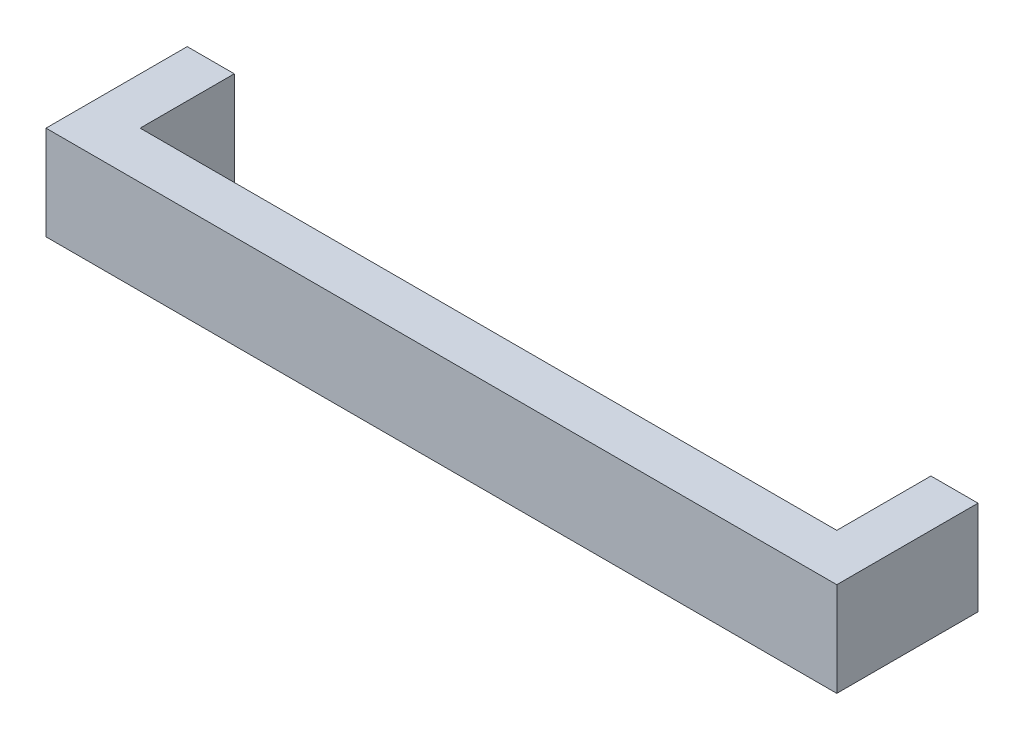
ISO-10303-21;
HEADER;
FILE_DESCRIPTION(('STEP AP214'),'2;1');
FILE_NAME('part.step','',(''),(''),'','','');
FILE_SCHEMA(('AUTOMOTIVE_DESIGN { 1 0 10303 214 1 1 1 1 }'));
ENDSEC;
DATA;
#1=APPLICATION_CONTEXT('core data for automotive mechanical design processes');
#2=APPLICATION_PROTOCOL_DEFINITION('international standard','automotive_design',2000,#1);
#3=PRODUCT_CONTEXT('',#1,'mechanical');
#4=PRODUCT('Part','Part','',(#3));
#5=PRODUCT_RELATED_PRODUCT_CATEGORY('part','',(#4));
#6=PRODUCT_DEFINITION_FORMATION('','',#4);
#7=PRODUCT_DEFINITION_CONTEXT('part definition',#1,'design');
#8=PRODUCT_DEFINITION('design','',#6,#7);
#9=PRODUCT_DEFINITION_SHAPE('','',#8);
#10=(LENGTH_UNIT() NAMED_UNIT(*) SI_UNIT(.MILLI.,.METRE.));
#11=(NAMED_UNIT(*) PLANE_ANGLE_UNIT() SI_UNIT($,.RADIAN.));
#12=(NAMED_UNIT(*) SI_UNIT($,.STERADIAN.) SOLID_ANGLE_UNIT());
#13=UNCERTAINTY_MEASURE_WITH_UNIT(LENGTH_MEASURE(1.E-05),#10,'distance_accuracy_value','');
#14=(GEOMETRIC_REPRESENTATION_CONTEXT(3) GLOBAL_UNCERTAINTY_ASSIGNED_CONTEXT((#13)) GLOBAL_UNIT_ASSIGNED_CONTEXT((#10,
#11,#12)) REPRESENTATION_CONTEXT('',''));
#15=CARTESIAN_POINT('',(0.,0.,0.));
#16=DIRECTION('',(0.,0.,1.));
#17=DIRECTION('',(1.,0.,0.));
#18=AXIS2_PLACEMENT_3D('',#15,#16,#17);
#19=CARTESIAN_POINT('',(79.,10.,0.));
#20=DIRECTION('',(-1.,0.,0.));
#21=DIRECTION('',(0.,0.,1.));
#22=AXIS2_PLACEMENT_3D('',#19,#20,#21);
#23=PLANE('',#22);
#24=DIRECTION('',(0.,0.,-1.));
#25=VECTOR('',#24,1.);
#26=CARTESIAN_POINT('',(79.,0.,0.));
#27=LINE('',#26,#25);
#28=CARTESIAN_POINT('',(79.,0.,5.));
#29=VERTEX_POINT('',#28);
#30=CARTESIAN_POINT('',(79.,0.,-10.));
#31=VERTEX_POINT('',#30);
#32=EDGE_CURVE('E134',#29,#31,#27,.T.);
#33=ORIENTED_EDGE('',*,*,#32,.T.);
#34=DIRECTION('',(0.,-1.,0.));
#35=VECTOR('',#34,1.);
#36=CARTESIAN_POINT('',(79.,10.,-10.));
#37=LINE('',#36,#35);
#38=CARTESIAN_POINT('',(79.,10.,-10.));
#39=VERTEX_POINT('',#38);
#40=EDGE_CURVE('E11',#39,#31,#37,.T.);
#41=ORIENTED_EDGE('',*,*,#40,.F.);
#42=DIRECTION('',(0.,0.,-1.));
#43=VECTOR('',#42,1.);
#44=CARTESIAN_POINT('',(79.,10.,0.));
#45=LINE('',#44,#43);
#46=CARTESIAN_POINT('',(79.,10.,5.));
#47=VERTEX_POINT('',#46);
#48=EDGE_CURVE('E92',#47,#39,#45,.T.);
#49=ORIENTED_EDGE('',*,*,#48,.F.);
#50=DIRECTION('',(0.,-1.,0.));
#51=VECTOR('',#50,1.);
#52=CARTESIAN_POINT('',(79.,10.,5.));
#53=LINE('',#52,#51);
#54=EDGE_CURVE('E133',#47,#29,#53,.T.);
#55=ORIENTED_EDGE('',*,*,#54,.T.);
#56=EDGE_LOOP('',(#33,#41,#49,#55));
#57=FACE_BOUND('',#56,.T.);
#58=ADVANCED_FACE('F37',(#57),#23,.F.);
#59=CARTESIAN_POINT('',(74.,10.,-10.));
#60=DIRECTION('',(0.,0.,-1.));
#61=DIRECTION('',(-1.,0.,0.));
#62=AXIS2_PLACEMENT_3D('',#59,#60,#61);
#63=PLANE('',#62);
#64=DIRECTION('',(1.,0.,0.));
#65=VECTOR('',#64,1.);
#66=CARTESIAN_POINT('',(74.,0.,-10.));
#67=LINE('',#66,#65);
#68=CARTESIAN_POINT('',(74.,0.,-10.));
#69=VERTEX_POINT('',#68);
#70=EDGE_CURVE('E137',#69,#31,#67,.T.);
#71=ORIENTED_EDGE('',*,*,#70,.F.);
#72=DIRECTION('',(0.,-1.,0.));
#73=VECTOR('',#72,1.);
#74=CARTESIAN_POINT('',(74.,10.,-10.));
#75=LINE('',#74,#73);
#76=CARTESIAN_POINT('',(74.,10.,-10.));
#77=VERTEX_POINT('',#76);
#78=EDGE_CURVE('E45',#77,#69,#75,.T.);
#79=ORIENTED_EDGE('',*,*,#78,.F.);
#80=DIRECTION('',(1.,0.,0.));
#81=VECTOR('',#80,1.);
#82=CARTESIAN_POINT('',(74.,10.,-10.));
#83=LINE('',#82,#81);
#84=EDGE_CURVE('E176',#77,#39,#83,.T.);
#85=ORIENTED_EDGE('',*,*,#84,.T.);
#86=ORIENTED_EDGE('',*,*,#40,.T.);
#87=EDGE_LOOP('',(#71,#79,#85,#86));
#88=FACE_BOUND('',#87,.T.);
#89=ADVANCED_FACE('F167',(#88),#63,.T.);
#90=CARTESIAN_POINT('',(74.,10.,0.));
#91=DIRECTION('',(-1.,0.,0.));
#92=DIRECTION('',(0.,0.,1.));
#93=AXIS2_PLACEMENT_3D('',#90,#91,#92);
#94=PLANE('',#93);
#95=DIRECTION('',(0.,0.,-1.));
#96=VECTOR('',#95,1.);
#97=CARTESIAN_POINT('',(74.,0.,0.));
#98=LINE('',#97,#96);
#99=CARTESIAN_POINT('',(74.,0.,0.));
#100=VERTEX_POINT('',#99);
#101=EDGE_CURVE('E140',#100,#69,#98,.T.);
#102=ORIENTED_EDGE('',*,*,#101,.F.);
#103=DIRECTION('',(0.,-1.,0.));
#104=VECTOR('',#103,1.);
#105=CARTESIAN_POINT('',(74.,10.,0.));
#106=LINE('',#105,#104);
#107=CARTESIAN_POINT('',(74.,10.,0.));
#108=VERTEX_POINT('',#107);
#109=EDGE_CURVE('E157',#108,#100,#106,.T.);
#110=ORIENTED_EDGE('',*,*,#109,.F.);
#111=DIRECTION('',(0.,0.,-1.));
#112=VECTOR('',#111,1.);
#113=CARTESIAN_POINT('',(74.,10.,0.));
#114=LINE('',#113,#112);
#115=EDGE_CURVE('E164',#108,#77,#114,.T.);
#116=ORIENTED_EDGE('',*,*,#115,.T.);
#117=ORIENTED_EDGE('',*,*,#78,.T.);
#118=EDGE_LOOP('',(#102,#110,#116,#117));
#119=FACE_BOUND('',#118,.T.);
#120=ADVANCED_FACE('F162',(#119),#94,.T.);
#121=CARTESIAN_POINT('',(0.,10.,0.));
#122=DIRECTION('',(0.,0.,-1.));
#123=DIRECTION('',(-1.,0.,0.));
#124=AXIS2_PLACEMENT_3D('',#121,#122,#123);
#125=PLANE('',#124);
#126=DIRECTION('',(1.,0.,0.));
#127=VECTOR('',#126,1.);
#128=CARTESIAN_POINT('',(0.,0.,0.));
#129=LINE('',#128,#127);
#130=CARTESIAN_POINT('',(0.,0.,0.));
#131=VERTEX_POINT('',#130);
#132=EDGE_CURVE('E143',#131,#100,#129,.T.);
#133=ORIENTED_EDGE('',*,*,#132,.F.);
#134=DIRECTION('',(0.,-1.,0.));
#135=VECTOR('',#134,1.);
#136=CARTESIAN_POINT('',(0.,10.,0.));
#137=LINE('',#136,#135);
#138=CARTESIAN_POINT('',(0.,10.,0.));
#139=VERTEX_POINT('',#138);
#140=EDGE_CURVE('E155',#139,#131,#137,.T.);
#141=ORIENTED_EDGE('',*,*,#140,.F.);
#142=DIRECTION('',(1.,0.,0.));
#143=VECTOR('',#142,1.);
#144=CARTESIAN_POINT('',(0.,10.,0.));
#145=LINE('',#144,#143);
#146=EDGE_CURVE('E128',#139,#108,#145,.T.);
#147=ORIENTED_EDGE('',*,*,#146,.T.);
#148=ORIENTED_EDGE('',*,*,#109,.T.);
#149=EDGE_LOOP('',(#133,#141,#147,#148));
#150=FACE_BOUND('',#149,.T.);
#151=ADVANCED_FACE('F174',(#150),#125,.T.);
#152=CARTESIAN_POINT('',(0.,10.,0.));
#153=DIRECTION('',(1.,0.,0.));
#154=DIRECTION('',(0.,0.,-1.));
#155=AXIS2_PLACEMENT_3D('',#152,#153,#154);
#156=PLANE('',#155);
#157=DIRECTION('',(0.,0.,1.));
#158=VECTOR('',#157,1.);
#159=CARTESIAN_POINT('',(0.,0.,0.));
#160=LINE('',#159,#158);
#161=CARTESIAN_POINT('',(0.,0.,-10.));
#162=VERTEX_POINT('',#161);
#163=EDGE_CURVE('E146',#162,#131,#160,.T.);
#164=ORIENTED_EDGE('',*,*,#163,.F.);
#165=DIRECTION('',(0.,-1.,0.));
#166=VECTOR('',#165,1.);
#167=CARTESIAN_POINT('',(0.,10.,-10.));
#168=LINE('',#167,#166);
#169=CARTESIAN_POINT('',(0.,10.,-10.));
#170=VERTEX_POINT('',#169);
#171=EDGE_CURVE('E116',#170,#162,#168,.T.);
#172=ORIENTED_EDGE('',*,*,#171,.F.);
#173=DIRECTION('',(0.,0.,1.));
#174=VECTOR('',#173,1.);
#175=CARTESIAN_POINT('',(0.,10.,0.));
#176=LINE('',#175,#174);
#177=EDGE_CURVE('E126',#170,#139,#176,.T.);
#178=ORIENTED_EDGE('',*,*,#177,.T.);
#179=ORIENTED_EDGE('',*,*,#140,.T.);
#180=EDGE_LOOP('',(#164,#172,#178,#179));
#181=FACE_BOUND('',#180,.T.);
#182=ADVANCED_FACE('F181',(#181),#156,.T.);
#183=CARTESIAN_POINT('',(-5.,10.,-10.));
#184=DIRECTION('',(0.,0.,-1.));
#185=DIRECTION('',(-1.,0.,0.));
#186=AXIS2_PLACEMENT_3D('',#183,#184,#185);
#187=PLANE('',#186);
#188=DIRECTION('',(1.,0.,0.));
#189=VECTOR('',#188,1.);
#190=CARTESIAN_POINT('',(-5.,0.,-10.));
#191=LINE('',#190,#189);
#192=CARTESIAN_POINT('',(-5.,0.,-10.));
#193=VERTEX_POINT('',#192);
#194=EDGE_CURVE('E115',#193,#162,#191,.T.);
#195=ORIENTED_EDGE('',*,*,#194,.F.);
#196=DIRECTION('',(0.,-1.,0.));
#197=VECTOR('',#196,1.);
#198=CARTESIAN_POINT('',(-5.,10.,-10.));
#199=LINE('',#198,#197);
#200=CARTESIAN_POINT('',(-5.,10.,-10.));
#201=VERTEX_POINT('',#200);
#202=EDGE_CURVE('E109',#201,#193,#199,.T.);
#203=ORIENTED_EDGE('',*,*,#202,.F.);
#204=DIRECTION('',(1.,0.,0.));
#205=VECTOR('',#204,1.);
#206=CARTESIAN_POINT('',(-5.,10.,-10.));
#207=LINE('',#206,#205);
#208=EDGE_CURVE('E113',#201,#170,#207,.T.);
#209=ORIENTED_EDGE('',*,*,#208,.T.);
#210=ORIENTED_EDGE('',*,*,#171,.T.);
#211=EDGE_LOOP('',(#195,#203,#209,#210));
#212=FACE_BOUND('',#211,.T.);
#213=ADVANCED_FACE('F111',(#212),#187,.T.);
#214=CARTESIAN_POINT('',(-5.,10.,0.));
#215=DIRECTION('',(1.,0.,0.));
#216=DIRECTION('',(0.,0.,-1.));
#217=AXIS2_PLACEMENT_3D('',#214,#215,#216);
#218=PLANE('',#217);
#219=DIRECTION('',(0.,0.,-1.));
#220=VECTOR('',#219,1.);
#221=CARTESIAN_POINT('',(-5.,0.,0.));
#222=LINE('',#221,#220);
#223=CARTESIAN_POINT('',(-5.,0.,5.));
#224=VERTEX_POINT('',#223);
#225=EDGE_CURVE('E80',#193,#224,#222,.F.);
#226=ORIENTED_EDGE('',*,*,#225,.T.);
#227=DIRECTION('',(0.,-1.,0.));
#228=VECTOR('',#227,1.);
#229=CARTESIAN_POINT('',(-5.,10.,5.));
#230=LINE('',#229,#228);
#231=CARTESIAN_POINT('',(-5.,10.,5.));
#232=VERTEX_POINT('',#231);
#233=EDGE_CURVE('E117',#232,#224,#230,.T.);
#234=ORIENTED_EDGE('',*,*,#233,.F.);
#235=DIRECTION('',(0.,0.,-1.));
#236=VECTOR('',#235,1.);
#237=CARTESIAN_POINT('',(-5.,10.,0.));
#238=LINE('',#237,#236);
#239=EDGE_CURVE('E119',#201,#232,#238,.F.);
#240=ORIENTED_EDGE('',*,*,#239,.F.);
#241=ORIENTED_EDGE('',*,*,#202,.T.);
#242=EDGE_LOOP('',(#226,#234,#240,#241));
#243=FACE_BOUND('',#242,.T.);
#244=ADVANCED_FACE('F120',(#243),#218,.F.);
#245=CARTESIAN_POINT('',(0.,10.,5.));
#246=DIRECTION('',(0.,0.,-1.));
#247=DIRECTION('',(-1.,0.,0.));
#248=AXIS2_PLACEMENT_3D('',#245,#246,#247);
#249=PLANE('',#248);
#250=DIRECTION('',(1.,0.,0.));
#251=VECTOR('',#250,1.);
#252=CARTESIAN_POINT('',(0.,0.,5.));
#253=LINE('',#252,#251);
#254=EDGE_CURVE('E86',#224,#29,#253,.T.);
#255=ORIENTED_EDGE('',*,*,#254,.T.);
#256=ORIENTED_EDGE('',*,*,#54,.F.);
#257=DIRECTION('',(1.,0.,0.));
#258=VECTOR('',#257,1.);
#259=CARTESIAN_POINT('',(0.,10.,5.));
#260=LINE('',#259,#258);
#261=EDGE_CURVE('E53',#232,#47,#260,.T.);
#262=ORIENTED_EDGE('',*,*,#261,.F.);
#263=ORIENTED_EDGE('',*,*,#233,.T.);
#264=EDGE_LOOP('',(#255,#256,#262,#263));
#265=FACE_BOUND('',#264,.T.);
#266=ADVANCED_FACE('F183',(#265),#249,.F.);
#267=CARTESIAN_POINT('',(0.,10.,0.));
#268=DIRECTION('',(0.,-1.,0.));
#269=DIRECTION('',(-1.,0.,0.));
#270=AXIS2_PLACEMENT_3D('',#267,#268,#269);
#271=PLANE('',#270);
#272=ORIENTED_EDGE('',*,*,#48,.T.);
#273=ORIENTED_EDGE('',*,*,#84,.F.);
#274=ORIENTED_EDGE('',*,*,#115,.F.);
#275=ORIENTED_EDGE('',*,*,#146,.F.);
#276=ORIENTED_EDGE('',*,*,#177,.F.);
#277=ORIENTED_EDGE('',*,*,#208,.F.);
#278=ORIENTED_EDGE('',*,*,#239,.T.);
#279=ORIENTED_EDGE('',*,*,#261,.T.);
#280=EDGE_LOOP('',(#272,#273,#274,#275,#276,#277,#278,#279));
#281=FACE_BOUND('',#280,.T.);
#282=ADVANCED_FACE('F123',(#281),#271,.F.);
#283=CARTESIAN_POINT('',(0.,0.,0.));
#284=DIRECTION('',(0.,-1.,0.));
#285=DIRECTION('',(-1.,0.,0.));
#286=AXIS2_PLACEMENT_3D('',#283,#284,#285);
#287=PLANE('',#286);
#288=ORIENTED_EDGE('',*,*,#32,.F.);
#289=ORIENTED_EDGE('',*,*,#254,.F.);
#290=ORIENTED_EDGE('',*,*,#225,.F.);
#291=ORIENTED_EDGE('',*,*,#194,.T.);
#292=ORIENTED_EDGE('',*,*,#163,.T.);
#293=ORIENTED_EDGE('',*,*,#132,.T.);
#294=ORIENTED_EDGE('',*,*,#101,.T.);
#295=ORIENTED_EDGE('',*,*,#70,.T.);
#296=EDGE_LOOP('',(#288,#289,#290,#291,#292,#293,#294,#295));
#297=FACE_BOUND('',#296,.T.);
#298=ADVANCED_FACE('F170',(#297),#287,.T.);
#299=CLOSED_SHELL('',(#58,#89,#120,#151,#182,#213,#244,#266,#282,#298));
#300=MANIFOLD_SOLID_BREP('B2',#299);
#301=ADVANCED_BREP_SHAPE_REPRESENTATION('',(#18,#300),#14);
#302=SHAPE_DEFINITION_REPRESENTATION(#9,#301);
ENDSEC;
END-ISO-10303-21;
